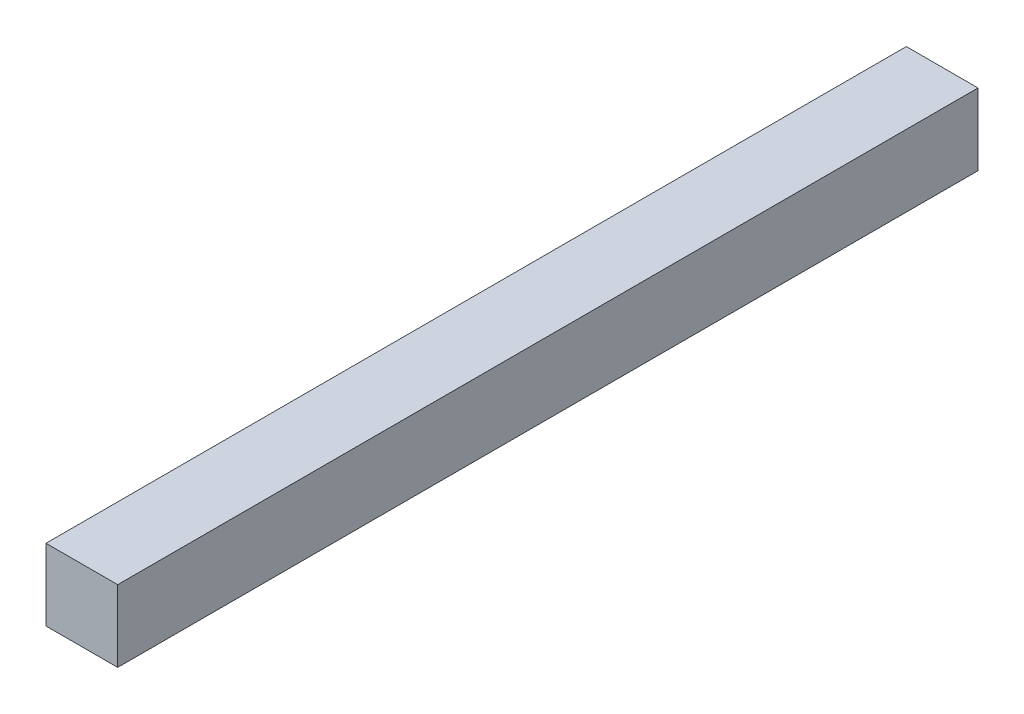
ISO-10303-21;
HEADER;
FILE_DESCRIPTION(('STEP AP214'),'2;1');
FILE_NAME('part.step','',(''),(''),'','','');
FILE_SCHEMA(('AUTOMOTIVE_DESIGN { 1 0 10303 214 1 1 1 1 }'));
ENDSEC;
DATA;
#1=APPLICATION_CONTEXT('core data for automotive mechanical design processes');
#2=APPLICATION_PROTOCOL_DEFINITION('international standard','automotive_design',2000,#1);
#3=PRODUCT_CONTEXT('',#1,'mechanical');
#4=PRODUCT('Part','Part','',(#3));
#5=PRODUCT_RELATED_PRODUCT_CATEGORY('part','',(#4));
#6=PRODUCT_DEFINITION_FORMATION('','',#4);
#7=PRODUCT_DEFINITION_CONTEXT('part definition',#1,'design');
#8=PRODUCT_DEFINITION('design','',#6,#7);
#9=PRODUCT_DEFINITION_SHAPE('','',#8);
#10=(LENGTH_UNIT() NAMED_UNIT(*) SI_UNIT(.MILLI.,.METRE.));
#11=(NAMED_UNIT(*) PLANE_ANGLE_UNIT() SI_UNIT($,.RADIAN.));
#12=(NAMED_UNIT(*) SI_UNIT($,.STERADIAN.) SOLID_ANGLE_UNIT());
#13=UNCERTAINTY_MEASURE_WITH_UNIT(LENGTH_MEASURE(1.E-05),#10,'distance_accuracy_value','');
#14=(GEOMETRIC_REPRESENTATION_CONTEXT(3) GLOBAL_UNCERTAINTY_ASSIGNED_CONTEXT((#13)) GLOBAL_UNIT_ASSIGNED_CONTEXT((#10,
#11,#12)) REPRESENTATION_CONTEXT('',''));
#15=CARTESIAN_POINT('',(0.,0.,0.));
#16=DIRECTION('',(0.,0.,1.));
#17=DIRECTION('',(1.,0.,0.));
#18=AXIS2_PLACEMENT_3D('',#15,#16,#17);
#19=CARTESIAN_POINT('',(0.,0.,38.1));
#20=DIRECTION('',(-1.,0.,0.));
#21=DIRECTION('',(0.,0.,1.));
#22=AXIS2_PLACEMENT_3D('',#19,#20,#21);
#23=PLANE('',#22);
#24=DIRECTION('',(0.,1.,0.));
#25=VECTOR('',#24,1.);
#26=CARTESIAN_POINT('',(0.,0.,0.));
#27=LINE('',#26,#25);
#28=CARTESIAN_POINT('',(0.,0.,0.));
#29=VERTEX_POINT('',#28);
#30=CARTESIAN_POINT('',(0.,3.175,0.));
#31=VERTEX_POINT('',#30);
#32=EDGE_CURVE('E95',#29,#31,#27,.T.);
#33=ORIENTED_EDGE('',*,*,#32,.T.);
#34=DIRECTION('',(0.,0.,-1.));
#35=VECTOR('',#34,1.);
#36=CARTESIAN_POINT('',(0.,3.175,38.1));
#37=LINE('',#36,#35);
#38=CARTESIAN_POINT('',(0.,3.175,38.1));
#39=VERTEX_POINT('',#38);
#40=EDGE_CURVE('E11',#39,#31,#37,.T.);
#41=ORIENTED_EDGE('',*,*,#40,.F.);
#42=DIRECTION('',(0.,1.,0.));
#43=VECTOR('',#42,1.);
#44=CARTESIAN_POINT('',(0.,0.,38.1));
#45=LINE('',#44,#43);
#46=CARTESIAN_POINT('',(0.,0.,38.1));
#47=VERTEX_POINT('',#46);
#48=EDGE_CURVE('E83',#47,#39,#45,.T.);
#49=ORIENTED_EDGE('',*,*,#48,.F.);
#50=DIRECTION('',(0.,0.,-1.));
#51=VECTOR('',#50,1.);
#52=CARTESIAN_POINT('',(0.,0.,38.1));
#53=LINE('',#52,#51);
#54=EDGE_CURVE('E91',#47,#29,#53,.T.);
#55=ORIENTED_EDGE('',*,*,#54,.T.);
#56=EDGE_LOOP('',(#33,#41,#49,#55));
#57=FACE_BOUND('',#56,.T.);
#58=ADVANCED_FACE('F32',(#57),#23,.F.);
#59=CARTESIAN_POINT('',(0.,3.175,38.1));
#60=DIRECTION('',(0.,-1.,0.));
#61=DIRECTION('',(1.,0.,0.));
#62=AXIS2_PLACEMENT_3D('',#59,#60,#61);
#63=PLANE('',#62);
#64=DIRECTION('',(-1.,0.,0.));
#65=VECTOR('',#64,1.);
#66=CARTESIAN_POINT('',(0.,3.175,0.));
#67=LINE('',#66,#65);
#68=CARTESIAN_POINT('',(-3.175,3.175,0.));
#69=VERTEX_POINT('',#68);
#70=EDGE_CURVE('E87',#31,#69,#67,.T.);
#71=ORIENTED_EDGE('',*,*,#70,.T.);
#72=DIRECTION('',(0.,0.,-1.));
#73=VECTOR('',#72,1.);
#74=CARTESIAN_POINT('',(-3.175,3.175,38.1));
#75=LINE('',#74,#73);
#76=CARTESIAN_POINT('',(-3.175,3.175,38.1));
#77=VERTEX_POINT('',#76);
#78=EDGE_CURVE('E40',#77,#69,#75,.T.);
#79=ORIENTED_EDGE('',*,*,#78,.F.);
#80=DIRECTION('',(-1.,0.,0.));
#81=VECTOR('',#80,1.);
#82=CARTESIAN_POINT('',(0.,3.175,38.1));
#83=LINE('',#82,#81);
#84=EDGE_CURVE('E78',#39,#77,#83,.T.);
#85=ORIENTED_EDGE('',*,*,#84,.F.);
#86=ORIENTED_EDGE('',*,*,#40,.T.);
#87=EDGE_LOOP('',(#71,#79,#85,#86));
#88=FACE_BOUND('',#87,.T.);
#89=ADVANCED_FACE('F86',(#88),#63,.F.);
#90=CARTESIAN_POINT('',(-3.175,0.,38.1));
#91=DIRECTION('',(1.,0.,0.));
#92=DIRECTION('',(0.,0.,-1.));
#93=AXIS2_PLACEMENT_3D('',#90,#91,#92);
#94=PLANE('',#93);
#95=DIRECTION('',(0.,-1.,0.));
#96=VECTOR('',#95,1.);
#97=CARTESIAN_POINT('',(-3.175,0.,0.));
#98=LINE('',#97,#96);
#99=CARTESIAN_POINT('',(-3.175,0.,0.));
#100=VERTEX_POINT('',#99);
#101=EDGE_CURVE('E65',#69,#100,#98,.T.);
#102=ORIENTED_EDGE('',*,*,#101,.T.);
#103=DIRECTION('',(0.,0.,-1.));
#104=VECTOR('',#103,1.);
#105=CARTESIAN_POINT('',(-3.175,0.,38.1));
#106=LINE('',#105,#104);
#107=CARTESIAN_POINT('',(-3.175,0.,38.1));
#108=VERTEX_POINT('',#107);
#109=EDGE_CURVE('E88',#108,#100,#106,.T.);
#110=ORIENTED_EDGE('',*,*,#109,.F.);
#111=DIRECTION('',(0.,-1.,0.));
#112=VECTOR('',#111,1.);
#113=CARTESIAN_POINT('',(-3.175,0.,38.1));
#114=LINE('',#113,#112);
#115=EDGE_CURVE('E81',#77,#108,#114,.T.);
#116=ORIENTED_EDGE('',*,*,#115,.F.);
#117=ORIENTED_EDGE('',*,*,#78,.T.);
#118=EDGE_LOOP('',(#102,#110,#116,#117));
#119=FACE_BOUND('',#118,.T.);
#120=ADVANCED_FACE('F89',(#119),#94,.F.);
#121=CARTESIAN_POINT('',(0.,0.,38.1));
#122=DIRECTION('',(0.,1.,0.));
#123=DIRECTION('',(0.,0.,1.));
#124=AXIS2_PLACEMENT_3D('',#121,#122,#123);
#125=PLANE('',#124);
#126=DIRECTION('',(1.,0.,0.));
#127=VECTOR('',#126,1.);
#128=CARTESIAN_POINT('',(0.,0.,0.));
#129=LINE('',#128,#127);
#130=EDGE_CURVE('E71',#100,#29,#129,.T.);
#131=ORIENTED_EDGE('',*,*,#130,.T.);
#132=ORIENTED_EDGE('',*,*,#54,.F.);
#133=DIRECTION('',(1.,0.,0.));
#134=VECTOR('',#133,1.);
#135=CARTESIAN_POINT('',(0.,0.,38.1));
#136=LINE('',#135,#134);
#137=EDGE_CURVE('E48',#108,#47,#136,.T.);
#138=ORIENTED_EDGE('',*,*,#137,.F.);
#139=ORIENTED_EDGE('',*,*,#109,.T.);
#140=EDGE_LOOP('',(#131,#132,#138,#139));
#141=FACE_BOUND('',#140,.T.);
#142=ADVANCED_FACE('F102',(#141),#125,.F.);
#143=CARTESIAN_POINT('',(0.,0.,38.1));
#144=DIRECTION('',(0.,0.,1.));
#145=DIRECTION('',(1.,0.,0.));
#146=AXIS2_PLACEMENT_3D('',#143,#144,#145);
#147=PLANE('',#146);
#148=ORIENTED_EDGE('',*,*,#48,.T.);
#149=ORIENTED_EDGE('',*,*,#84,.T.);
#150=ORIENTED_EDGE('',*,*,#115,.T.);
#151=ORIENTED_EDGE('',*,*,#137,.T.);
#152=EDGE_LOOP('',(#148,#149,#150,#151));
#153=FACE_BOUND('',#152,.T.);
#154=ADVANCED_FACE('F79',(#153),#147,.T.);
#155=CARTESIAN_POINT('',(0.,0.,0.));
#156=DIRECTION('',(0.,0.,1.));
#157=DIRECTION('',(1.,0.,0.));
#158=AXIS2_PLACEMENT_3D('',#155,#156,#157);
#159=PLANE('',#158);
#160=ORIENTED_EDGE('',*,*,#32,.F.);
#161=ORIENTED_EDGE('',*,*,#130,.F.);
#162=ORIENTED_EDGE('',*,*,#101,.F.);
#163=ORIENTED_EDGE('',*,*,#70,.F.);
#164=EDGE_LOOP('',(#160,#161,#162,#163));
#165=FACE_BOUND('',#164,.T.);
#166=ADVANCED_FACE('F105',(#165),#159,.F.);
#167=CLOSED_SHELL('',(#58,#89,#120,#142,#154,#166));
#168=MANIFOLD_SOLID_BREP('B2',#167);
#169=ADVANCED_BREP_SHAPE_REPRESENTATION('',(#18,#168),#14);
#170=SHAPE_DEFINITION_REPRESENTATION(#9,#169);
ENDSEC;
END-ISO-10303-21;
